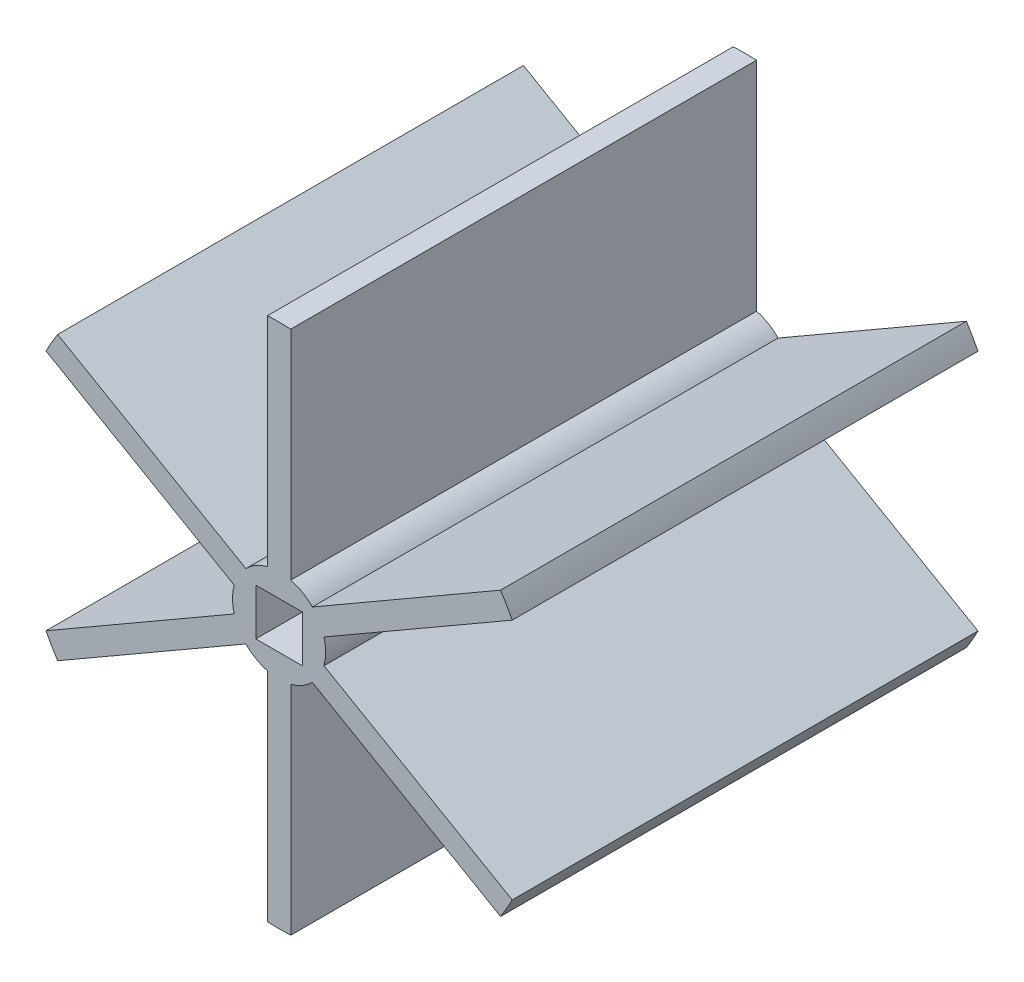
ISO-10303-21;
HEADER;
FILE_DESCRIPTION(('STEP AP214'),'2;1');
FILE_NAME('part.step','',(''),(''),'','','');
FILE_SCHEMA(('AUTOMOTIVE_DESIGN { 1 0 10303 214 1 1 1 1 }'));
ENDSEC;
DATA;
#1=APPLICATION_CONTEXT('core data for automotive mechanical design processes');
#2=APPLICATION_PROTOCOL_DEFINITION('international standard','automotive_design',2000,#1);
#3=PRODUCT_CONTEXT('',#1,'mechanical');
#4=PRODUCT('Part','Part','',(#3));
#5=PRODUCT_RELATED_PRODUCT_CATEGORY('part','',(#4));
#6=PRODUCT_DEFINITION_FORMATION('','',#4);
#7=PRODUCT_DEFINITION_CONTEXT('part definition',#1,'design');
#8=PRODUCT_DEFINITION('design','',#6,#7);
#9=PRODUCT_DEFINITION_SHAPE('','',#8);
#10=(LENGTH_UNIT() NAMED_UNIT(*) SI_UNIT(.MILLI.,.METRE.));
#11=(NAMED_UNIT(*) PLANE_ANGLE_UNIT() SI_UNIT($,.RADIAN.));
#12=(NAMED_UNIT(*) SI_UNIT($,.STERADIAN.) SOLID_ANGLE_UNIT());
#13=UNCERTAINTY_MEASURE_WITH_UNIT(LENGTH_MEASURE(1.E-05),#10,'distance_accuracy_value','');
#14=(GEOMETRIC_REPRESENTATION_CONTEXT(3) GLOBAL_UNCERTAINTY_ASSIGNED_CONTEXT((#13)) GLOBAL_UNIT_ASSIGNED_CONTEXT((#10,
#11,#12)) REPRESENTATION_CONTEXT('',''));
#15=CARTESIAN_POINT('',(0.,0.,0.));
#16=DIRECTION('',(0.,0.,1.));
#17=DIRECTION('',(1.,0.,0.));
#18=AXIS2_PLACEMENT_3D('',#15,#16,#17);
#19=CARTESIAN_POINT('',(0.624999999999983,1.08253175473052,25.));
#20=DIRECTION('',(-0.499999999999999,-0.866025403784439,0.));
#21=DIRECTION('',(0.866025403784439,-0.499999999999999,0.));
#22=AXIS2_PLACEMENT_3D('',#19,#20,#21);
#23=PLANE('',#22);
#24=DIRECTION('',(-0.866025403784439,0.499999999999999,0.));
#25=VECTOR('',#24,1.);
#26=CARTESIAN_POINT('',(0.624999999999983,1.08253175473052,-25.));
#27=LINE('',#26,#25);
#28=CARTESIAN_POINT('',(25.0229123082283,-13.00360948409,-25.));
#29=VERTEX_POINT('',#28);
#30=CARTESIAN_POINT('',(4.8176274578121,-1.33808283664911,-25.));
#31=VERTEX_POINT('',#30);
#32=EDGE_CURVE('E270',#29,#31,#27,.T.);
#33=ORIENTED_EDGE('',*,*,#32,.T.);
#34=DIRECTION('',(0.,0.,-1.));
#35=VECTOR('',#34,1.);
#36=CARTESIAN_POINT('',(4.8176274578121,-1.33808283664911,25.));
#37=LINE('',#36,#35);
#38=CARTESIAN_POINT('',(4.8176274578121,-1.33808283664911,25.));
#39=VERTEX_POINT('',#38);
#40=EDGE_CURVE('E11',#39,#31,#37,.T.);
#41=ORIENTED_EDGE('',*,*,#40,.F.);
#42=DIRECTION('',(-0.866025403784439,0.499999999999999,0.));
#43=VECTOR('',#42,1.);
#44=CARTESIAN_POINT('',(0.624999999999983,1.08253175473052,25.));
#45=LINE('',#44,#43);
#46=CARTESIAN_POINT('',(25.0229123082283,-13.00360948409,25.));
#47=VERTEX_POINT('',#46);
#48=EDGE_CURVE('E511',#47,#39,#45,.T.);
#49=ORIENTED_EDGE('',*,*,#48,.F.);
#50=DIRECTION('',(0.,0.,-1.));
#51=VECTOR('',#50,1.);
#52=CARTESIAN_POINT('',(25.0229123082283,-13.00360948409,25.));
#53=LINE('',#52,#51);
#54=EDGE_CURVE('E53',#47,#29,#53,.T.);
#55=ORIENTED_EDGE('',*,*,#54,.T.);
#56=EDGE_LOOP('',(#33,#41,#49,#55));
#57=FACE_BOUND('',#56,.T.);
#58=ADVANCED_FACE('F34',(#57),#23,.F.);
#59=CARTESIAN_POINT('',(0.,0.,25.));
#60=DIRECTION('',(0.,0.,-1.));
#61=DIRECTION('',(-1.,0.,0.));
#62=AXIS2_PLACEMENT_3D('',#59,#60,#61);
#63=CYLINDRICAL_SURFACE('',#62,5.);
#64=CARTESIAN_POINT('',(0.,0.,-25.));
#65=DIRECTION('',(0.,0.,1.));
#66=DIRECTION('',(1.,0.,0.));
#67=AXIS2_PLACEMENT_3D('',#64,#65,#66);
#68=CIRCLE('',#67,5.);
#69=CARTESIAN_POINT('',(4.81762745781211,1.33808283664908,-25.));
#70=VERTEX_POINT('',#69);
#71=EDGE_CURVE('E272',#31,#70,#68,.T.);
#72=ORIENTED_EDGE('',*,*,#71,.T.);
#73=DIRECTION('',(0.,0.,-1.));
#74=VECTOR('',#73,1.);
#75=CARTESIAN_POINT('',(4.81762745781211,1.33808283664908,25.));
#76=LINE('',#75,#74);
#77=CARTESIAN_POINT('',(4.81762745781211,1.33808283664908,25.));
#78=VERTEX_POINT('',#77);
#79=EDGE_CURVE('E44',#78,#70,#76,.T.);
#80=ORIENTED_EDGE('',*,*,#79,.F.);
#81=CARTESIAN_POINT('',(0.,0.,25.));
#82=DIRECTION('',(0.,0.,1.));
#83=DIRECTION('',(1.,0.,0.));
#84=AXIS2_PLACEMENT_3D('',#81,#82,#83);
#85=CIRCLE('',#84,5.);
#86=EDGE_CURVE('E513',#39,#78,#85,.T.);
#87=ORIENTED_EDGE('',*,*,#86,.F.);
#88=ORIENTED_EDGE('',*,*,#40,.T.);
#89=EDGE_LOOP('',(#72,#80,#87,#88));
#90=FACE_BOUND('',#89,.T.);
#91=ADVANCED_FACE('F409',(#90),#63,.T.);
#92=CARTESIAN_POINT('',(0.625000000000005,-1.08253175473056,25.));
#93=DIRECTION('',(0.5,-0.866025403784438,0.));
#94=DIRECTION('',(0.866025403784438,0.5,0.));
#95=AXIS2_PLACEMENT_3D('',#92,#93,#94);
#96=PLANE('',#95);
#97=DIRECTION('',(-0.866025403784438,-0.5,0.));
#98=VECTOR('',#97,1.);
#99=CARTESIAN_POINT('',(0.625000000000005,-1.08253175473056,-25.));
#100=LINE('',#99,#98);
#101=CARTESIAN_POINT('',(25.0229123082283,13.00360948409,-25.));
#102=VERTEX_POINT('',#101);
#103=EDGE_CURVE('E275',#102,#70,#100,.T.);
#104=ORIENTED_EDGE('',*,*,#103,.F.);
#105=DIRECTION('',(0.,0.,-1.));
#106=VECTOR('',#105,1.);
#107=CARTESIAN_POINT('',(25.0229123082283,13.00360948409,25.));
#108=LINE('',#107,#106);
#109=CARTESIAN_POINT('',(25.0229123082283,13.00360948409,25.));
#110=VERTEX_POINT('',#109);
#111=EDGE_CURVE('E375',#110,#102,#108,.T.);
#112=ORIENTED_EDGE('',*,*,#111,.F.);
#113=DIRECTION('',(-0.866025403784438,-0.5,0.));
#114=VECTOR('',#113,1.);
#115=CARTESIAN_POINT('',(0.625000000000005,-1.08253175473056,25.));
#116=LINE('',#115,#114);
#117=EDGE_CURVE('E515',#110,#78,#116,.T.);
#118=ORIENTED_EDGE('',*,*,#117,.T.);
#119=ORIENTED_EDGE('',*,*,#79,.T.);
#120=EDGE_LOOP('',(#104,#112,#118,#119));
#121=FACE_BOUND('',#120,.T.);
#122=ADVANCED_FACE('F414',(#121),#96,.T.);
#123=CARTESIAN_POINT('',(0.,0.,25.));
#124=DIRECTION('',(0.,0.,-1.));
#125=DIRECTION('',(-1.,0.,0.));
#126=AXIS2_PLACEMENT_3D('',#123,#124,#125);
#127=CYLINDRICAL_SURFACE('',#126,28.2);
#128=CARTESIAN_POINT('',(0.,0.,-25.));
#129=DIRECTION('',(0.,0.,1.));
#130=DIRECTION('',(1.,0.,0.));
#131=AXIS2_PLACEMENT_3D('',#128,#129,#130);
#132=CIRCLE('',#131,28.2);
#133=CARTESIAN_POINT('',(23.7729123082283,15.1686729935511,-25.));
#134=VERTEX_POINT('',#133);
#135=EDGE_CURVE('E278',#134,#102,#132,.F.);
#136=ORIENTED_EDGE('',*,*,#135,.F.);
#137=DIRECTION('',(0.,0.,-1.));
#138=VECTOR('',#137,1.);
#139=CARTESIAN_POINT('',(23.7729123082283,15.1686729935511,25.));
#140=LINE('',#139,#138);
#141=CARTESIAN_POINT('',(23.7729123082283,15.1686729935511,25.));
#142=VERTEX_POINT('',#141);
#143=EDGE_CURVE('E373',#142,#134,#140,.T.);
#144=ORIENTED_EDGE('',*,*,#143,.F.);
#145=CARTESIAN_POINT('',(0.,0.,25.));
#146=DIRECTION('',(0.,0.,1.));
#147=DIRECTION('',(1.,0.,0.));
#148=AXIS2_PLACEMENT_3D('',#145,#146,#147);
#149=CIRCLE('',#148,28.2);
#150=EDGE_CURVE('E518',#142,#110,#149,.F.);
#151=ORIENTED_EDGE('',*,*,#150,.T.);
#152=ORIENTED_EDGE('',*,*,#111,.T.);
#153=EDGE_LOOP('',(#136,#144,#151,#152));
#154=FACE_BOUND('',#153,.T.);
#155=ADVANCED_FACE('F420',(#154),#127,.T.);
#156=CARTESIAN_POINT('',(-0.624999999999993,1.08253175473054,25.));
#157=DIRECTION('',(0.500000000000001,-0.866025403784438,0.));
#158=DIRECTION('',(0.866025403784438,0.500000000000001,0.));
#159=AXIS2_PLACEMENT_3D('',#156,#157,#158);
#160=PLANE('',#159);
#161=DIRECTION('',(-0.866025403784438,-0.500000000000001,0.));
#162=VECTOR('',#161,1.);
#163=CARTESIAN_POINT('',(-0.624999999999993,1.08253175473054,-25.));
#164=LINE('',#163,#162);
#165=CARTESIAN_POINT('',(3.56762745781211,3.50314634611018,-25.));
#166=VERTEX_POINT('',#165);
#167=EDGE_CURVE('E281',#134,#166,#164,.T.);
#168=ORIENTED_EDGE('',*,*,#167,.T.);
#169=DIRECTION('',(0.,0.,-1.));
#170=VECTOR('',#169,1.);
#171=CARTESIAN_POINT('',(3.56762745781211,3.50314634611018,25.));
#172=LINE('',#171,#170);
#173=CARTESIAN_POINT('',(3.56762745781211,3.50314634611018,25.));
#174=VERTEX_POINT('',#173);
#175=EDGE_CURVE('E370',#174,#166,#172,.T.);
#176=ORIENTED_EDGE('',*,*,#175,.F.);
#177=DIRECTION('',(-0.866025403784438,-0.500000000000001,0.));
#178=VECTOR('',#177,1.);
#179=CARTESIAN_POINT('',(-0.624999999999993,1.08253175473054,25.));
#180=LINE('',#179,#178);
#181=EDGE_CURVE('E521',#142,#174,#180,.T.);
#182=ORIENTED_EDGE('',*,*,#181,.F.);
#183=ORIENTED_EDGE('',*,*,#143,.T.);
#184=EDGE_LOOP('',(#168,#176,#182,#183));
#185=FACE_BOUND('',#184,.T.);
#186=ADVANCED_FACE('F424',(#185),#160,.F.);
#187=CARTESIAN_POINT('',(0.,0.,25.));
#188=DIRECTION('',(0.,0.,-1.));
#189=DIRECTION('',(-1.,0.,0.));
#190=AXIS2_PLACEMENT_3D('',#187,#188,#189);
#191=CYLINDRICAL_SURFACE('',#190,5.);
#192=CARTESIAN_POINT('',(0.,0.,-25.));
#193=DIRECTION('',(0.,0.,1.));
#194=DIRECTION('',(1.,0.,0.));
#195=AXIS2_PLACEMENT_3D('',#192,#193,#194);
#196=CIRCLE('',#195,5.);
#197=CARTESIAN_POINT('',(1.25,4.84122918275927,-25.));
#198=VERTEX_POINT('',#197);
#199=EDGE_CURVE('E283',#166,#198,#196,.T.);
#200=ORIENTED_EDGE('',*,*,#199,.T.);
#201=DIRECTION('',(0.,0.,-1.));
#202=VECTOR('',#201,1.);
#203=CARTESIAN_POINT('',(1.25,4.84122918275927,25.));
#204=LINE('',#203,#202);
#205=CARTESIAN_POINT('',(1.25,4.84122918275927,25.));
#206=VERTEX_POINT('',#205);
#207=EDGE_CURVE('E368',#206,#198,#204,.T.);
#208=ORIENTED_EDGE('',*,*,#207,.F.);
#209=CARTESIAN_POINT('',(0.,0.,25.));
#210=DIRECTION('',(0.,0.,1.));
#211=DIRECTION('',(1.,0.,0.));
#212=AXIS2_PLACEMENT_3D('',#209,#210,#211);
#213=CIRCLE('',#212,5.);
#214=EDGE_CURVE('E523',#174,#206,#213,.T.);
#215=ORIENTED_EDGE('',*,*,#214,.F.);
#216=ORIENTED_EDGE('',*,*,#175,.T.);
#217=EDGE_LOOP('',(#200,#208,#215,#216));
#218=FACE_BOUND('',#217,.T.);
#219=ADVANCED_FACE('F428',(#218),#191,.T.);
#220=CARTESIAN_POINT('',(1.25,0.,25.));
#221=DIRECTION('',(1.,0.,0.));
#222=DIRECTION('',(0.,1.,0.));
#223=AXIS2_PLACEMENT_3D('',#220,#221,#222);
#224=PLANE('',#223);
#225=DIRECTION('',(0.,-1.,0.));
#226=VECTOR('',#225,1.);
#227=CARTESIAN_POINT('',(1.25,0.,-25.));
#228=LINE('',#227,#226);
#229=CARTESIAN_POINT('',(1.25,28.172282477641,-25.));
#230=VERTEX_POINT('',#229);
#231=EDGE_CURVE('E286',#230,#198,#228,.T.);
#232=ORIENTED_EDGE('',*,*,#231,.F.);
#233=DIRECTION('',(0.,0.,-1.));
#234=VECTOR('',#233,1.);
#235=CARTESIAN_POINT('',(1.25,28.172282477641,25.));
#236=LINE('',#235,#234);
#237=CARTESIAN_POINT('',(1.25,28.172282477641,25.));
#238=VERTEX_POINT('',#237);
#239=EDGE_CURVE('E366',#238,#230,#236,.T.);
#240=ORIENTED_EDGE('',*,*,#239,.F.);
#241=DIRECTION('',(0.,-1.,0.));
#242=VECTOR('',#241,1.);
#243=CARTESIAN_POINT('',(1.25,0.,25.));
#244=LINE('',#243,#242);
#245=EDGE_CURVE('E525',#238,#206,#244,.T.);
#246=ORIENTED_EDGE('',*,*,#245,.T.);
#247=ORIENTED_EDGE('',*,*,#207,.T.);
#248=EDGE_LOOP('',(#232,#240,#246,#247));
#249=FACE_BOUND('',#248,.T.);
#250=ADVANCED_FACE('F432',(#249),#224,.T.);
#251=CARTESIAN_POINT('',(0.,0.,25.));
#252=DIRECTION('',(0.,0.,-1.));
#253=DIRECTION('',(-1.,0.,0.));
#254=AXIS2_PLACEMENT_3D('',#251,#252,#253);
#255=CYLINDRICAL_SURFACE('',#254,28.2);
#256=CARTESIAN_POINT('',(0.,0.,-25.));
#257=DIRECTION('',(0.,0.,1.));
#258=DIRECTION('',(1.,0.,0.));
#259=AXIS2_PLACEMENT_3D('',#256,#257,#258);
#260=CIRCLE('',#259,28.2);
#261=CARTESIAN_POINT('',(-1.25,28.172282477641,-25.));
#262=VERTEX_POINT('',#261);
#263=EDGE_CURVE('E289',#262,#230,#260,.F.);
#264=ORIENTED_EDGE('',*,*,#263,.F.);
#265=DIRECTION('',(0.,0.,-1.));
#266=VECTOR('',#265,1.);
#267=CARTESIAN_POINT('',(-1.25,28.172282477641,25.));
#268=LINE('',#267,#266);
#269=CARTESIAN_POINT('',(-1.25,28.172282477641,25.));
#270=VERTEX_POINT('',#269);
#271=EDGE_CURVE('E364',#270,#262,#268,.T.);
#272=ORIENTED_EDGE('',*,*,#271,.F.);
#273=CARTESIAN_POINT('',(0.,0.,25.));
#274=DIRECTION('',(0.,0.,1.));
#275=DIRECTION('',(1.,0.,0.));
#276=AXIS2_PLACEMENT_3D('',#273,#274,#275);
#277=CIRCLE('',#276,28.2);
#278=EDGE_CURVE('E528',#270,#238,#277,.F.);
#279=ORIENTED_EDGE('',*,*,#278,.T.);
#280=ORIENTED_EDGE('',*,*,#239,.T.);
#281=EDGE_LOOP('',(#264,#272,#279,#280));
#282=FACE_BOUND('',#281,.T.);
#283=ADVANCED_FACE('F436',(#282),#255,.T.);
#284=CARTESIAN_POINT('',(-1.25,0.,25.));
#285=DIRECTION('',(1.,0.,0.));
#286=DIRECTION('',(0.,1.,0.));
#287=AXIS2_PLACEMENT_3D('',#284,#285,#286);
#288=PLANE('',#287);
#289=DIRECTION('',(0.,-1.,0.));
#290=VECTOR('',#289,1.);
#291=CARTESIAN_POINT('',(-1.25,0.,-25.));
#292=LINE('',#291,#290);
#293=CARTESIAN_POINT('',(-1.25,4.84122918275927,-25.));
#294=VERTEX_POINT('',#293);
#295=EDGE_CURVE('E292',#262,#294,#292,.T.);
#296=ORIENTED_EDGE('',*,*,#295,.T.);
#297=DIRECTION('',(0.,0.,-1.));
#298=VECTOR('',#297,1.);
#299=CARTESIAN_POINT('',(-1.25,4.84122918275927,25.));
#300=LINE('',#299,#298);
#301=CARTESIAN_POINT('',(-1.25,4.84122918275927,25.));
#302=VERTEX_POINT('',#301);
#303=EDGE_CURVE('E361',#302,#294,#300,.T.);
#304=ORIENTED_EDGE('',*,*,#303,.F.);
#305=DIRECTION('',(0.,-1.,0.));
#306=VECTOR('',#305,1.);
#307=CARTESIAN_POINT('',(-1.25,0.,25.));
#308=LINE('',#307,#306);
#309=EDGE_CURVE('E531',#270,#302,#308,.T.);
#310=ORIENTED_EDGE('',*,*,#309,.F.);
#311=ORIENTED_EDGE('',*,*,#271,.T.);
#312=EDGE_LOOP('',(#296,#304,#310,#311));
#313=FACE_BOUND('',#312,.T.);
#314=ADVANCED_FACE('F440',(#313),#288,.F.);
#315=CARTESIAN_POINT('',(0.,0.,25.));
#316=DIRECTION('',(0.,0.,-1.));
#317=DIRECTION('',(-1.,0.,0.));
#318=AXIS2_PLACEMENT_3D('',#315,#316,#317);
#319=CYLINDRICAL_SURFACE('',#318,5.);
#320=CARTESIAN_POINT('',(0.,0.,-25.));
#321=DIRECTION('',(0.,0.,1.));
#322=DIRECTION('',(1.,0.,0.));
#323=AXIS2_PLACEMENT_3D('',#320,#321,#322);
#324=CIRCLE('',#323,5.);
#325=CARTESIAN_POINT('',(-3.56762745781206,3.50314634611022,-25.));
#326=VERTEX_POINT('',#325);
#327=EDGE_CURVE('E294',#294,#326,#324,.T.);
#328=ORIENTED_EDGE('',*,*,#327,.T.);
#329=DIRECTION('',(0.,0.,-1.));
#330=VECTOR('',#329,1.);
#331=CARTESIAN_POINT('',(-3.56762745781206,3.50314634611022,25.));
#332=LINE('',#331,#330);
#333=CARTESIAN_POINT('',(-3.56762745781206,3.50314634611022,25.));
#334=VERTEX_POINT('',#333);
#335=EDGE_CURVE('E359',#334,#326,#332,.T.);
#336=ORIENTED_EDGE('',*,*,#335,.F.);
#337=CARTESIAN_POINT('',(0.,0.,25.));
#338=DIRECTION('',(0.,0.,1.));
#339=DIRECTION('',(1.,0.,0.));
#340=AXIS2_PLACEMENT_3D('',#337,#338,#339);
#341=CIRCLE('',#340,5.);
#342=EDGE_CURVE('E533',#302,#334,#341,.T.);
#343=ORIENTED_EDGE('',*,*,#342,.F.);
#344=ORIENTED_EDGE('',*,*,#303,.T.);
#345=EDGE_LOOP('',(#328,#336,#343,#344));
#346=FACE_BOUND('',#345,.T.);
#347=ADVANCED_FACE('F444',(#346),#319,.T.);
#348=CARTESIAN_POINT('',(0.625000000000032,1.08253175473061,25.));
#349=DIRECTION('',(0.499999999999997,0.86602540378444,0.));
#350=DIRECTION('',(-0.86602540378444,0.499999999999997,0.));
#351=AXIS2_PLACEMENT_3D('',#348,#349,#350);
#352=PLANE('',#351);
#353=DIRECTION('',(0.86602540378444,-0.499999999999997,0.));
#354=VECTOR('',#353,1.);
#355=CARTESIAN_POINT('',(0.625000000000032,1.08253175473061,-25.));
#356=LINE('',#355,#354);
#357=CARTESIAN_POINT('',(-23.7729123082284,15.168672993551,-25.));
#358=VERTEX_POINT('',#357);
#359=EDGE_CURVE('E297',#358,#326,#356,.T.);
#360=ORIENTED_EDGE('',*,*,#359,.F.);
#361=DIRECTION('',(0.,0.,-1.));
#362=VECTOR('',#361,1.);
#363=CARTESIAN_POINT('',(-23.7729123082284,15.168672993551,25.));
#364=LINE('',#363,#362);
#365=CARTESIAN_POINT('',(-23.7729123082284,15.168672993551,25.));
#366=VERTEX_POINT('',#365);
#367=EDGE_CURVE('E357',#366,#358,#364,.T.);
#368=ORIENTED_EDGE('',*,*,#367,.F.);
#369=DIRECTION('',(0.86602540378444,-0.499999999999997,0.));
#370=VECTOR('',#369,1.);
#371=CARTESIAN_POINT('',(0.625000000000032,1.08253175473061,25.));
#372=LINE('',#371,#370);
#373=EDGE_CURVE('E535',#366,#334,#372,.T.);
#374=ORIENTED_EDGE('',*,*,#373,.T.);
#375=ORIENTED_EDGE('',*,*,#335,.T.);
#376=EDGE_LOOP('',(#360,#368,#374,#375));
#377=FACE_BOUND('',#376,.T.);
#378=ADVANCED_FACE('F448',(#377),#352,.T.);
#379=CARTESIAN_POINT('',(0.,0.,25.));
#380=DIRECTION('',(0.,0.,-1.));
#381=DIRECTION('',(-1.,0.,0.));
#382=AXIS2_PLACEMENT_3D('',#379,#380,#381);
#383=CYLINDRICAL_SURFACE('',#382,28.2);
#384=CARTESIAN_POINT('',(0.,0.,-25.));
#385=DIRECTION('',(0.,0.,1.));
#386=DIRECTION('',(1.,0.,0.));
#387=AXIS2_PLACEMENT_3D('',#384,#385,#386);
#388=CIRCLE('',#387,28.2);
#389=CARTESIAN_POINT('',(-25.0229123082284,13.0036094840899,-25.));
#390=VERTEX_POINT('',#389);
#391=EDGE_CURVE('E300',#390,#358,#388,.F.);
#392=ORIENTED_EDGE('',*,*,#391,.F.);
#393=DIRECTION('',(0.,0.,-1.));
#394=VECTOR('',#393,1.);
#395=CARTESIAN_POINT('',(-25.0229123082284,13.0036094840899,25.));
#396=LINE('',#395,#394);
#397=CARTESIAN_POINT('',(-25.0229123082284,13.0036094840899,25.));
#398=VERTEX_POINT('',#397);
#399=EDGE_CURVE('E355',#398,#390,#396,.T.);
#400=ORIENTED_EDGE('',*,*,#399,.F.);
#401=CARTESIAN_POINT('',(0.,0.,25.));
#402=DIRECTION('',(0.,0.,1.));
#403=DIRECTION('',(1.,0.,0.));
#404=AXIS2_PLACEMENT_3D('',#401,#402,#403);
#405=CIRCLE('',#404,28.2);
#406=EDGE_CURVE('E538',#398,#366,#405,.F.);
#407=ORIENTED_EDGE('',*,*,#406,.T.);
#408=ORIENTED_EDGE('',*,*,#367,.T.);
#409=EDGE_LOOP('',(#392,#400,#407,#408));
#410=FACE_BOUND('',#409,.T.);
#411=ADVANCED_FACE('F452',(#410),#383,.T.);
#412=CARTESIAN_POINT('',(-0.624999999999956,-1.08253175473048,25.));
#413=DIRECTION('',(0.499999999999997,0.86602540378444,0.));
#414=DIRECTION('',(-0.866025403784441,0.499999999999997,0.));
#415=AXIS2_PLACEMENT_3D('',#412,#413,#414);
#416=PLANE('',#415);
#417=DIRECTION('',(0.866025403784441,-0.499999999999997,0.));
#418=VECTOR('',#417,1.);
#419=CARTESIAN_POINT('',(-0.624999999999956,-1.08253175473048,-25.));
#420=LINE('',#419,#418);
#421=CARTESIAN_POINT('',(-4.81762745781209,1.33808283664915,-25.));
#422=VERTEX_POINT('',#421);
#423=EDGE_CURVE('E303',#390,#422,#420,.T.);
#424=ORIENTED_EDGE('',*,*,#423,.T.);
#425=DIRECTION('',(0.,0.,-1.));
#426=VECTOR('',#425,1.);
#427=CARTESIAN_POINT('',(-4.81762745781209,1.33808283664915,25.));
#428=LINE('',#427,#426);
#429=CARTESIAN_POINT('',(-4.81762745781209,1.33808283664915,25.));
#430=VERTEX_POINT('',#429);
#431=EDGE_CURVE('E352',#430,#422,#428,.T.);
#432=ORIENTED_EDGE('',*,*,#431,.F.);
#433=DIRECTION('',(0.866025403784441,-0.499999999999997,0.));
#434=VECTOR('',#433,1.);
#435=CARTESIAN_POINT('',(-0.624999999999956,-1.08253175473048,25.));
#436=LINE('',#435,#434);
#437=EDGE_CURVE('E541',#398,#430,#436,.T.);
#438=ORIENTED_EDGE('',*,*,#437,.F.);
#439=ORIENTED_EDGE('',*,*,#399,.T.);
#440=EDGE_LOOP('',(#424,#432,#438,#439));
#441=FACE_BOUND('',#440,.T.);
#442=ADVANCED_FACE('F456',(#441),#416,.F.);
#443=CARTESIAN_POINT('',(0.,0.,25.));
#444=DIRECTION('',(0.,0.,-1.));
#445=DIRECTION('',(-1.,0.,0.));
#446=AXIS2_PLACEMENT_3D('',#443,#444,#445);
#447=CYLINDRICAL_SURFACE('',#446,5.);
#448=CARTESIAN_POINT('',(0.,0.,-25.));
#449=DIRECTION('',(0.,0.,1.));
#450=DIRECTION('',(1.,0.,0.));
#451=AXIS2_PLACEMENT_3D('',#448,#449,#450);
#452=CIRCLE('',#451,5.);
#453=CARTESIAN_POINT('',(-4.81762745781211,-1.33808283664904,-25.));
#454=VERTEX_POINT('',#453);
#455=EDGE_CURVE('E305',#422,#454,#452,.T.);
#456=ORIENTED_EDGE('',*,*,#455,.T.);
#457=DIRECTION('',(0.,0.,-1.));
#458=VECTOR('',#457,1.);
#459=CARTESIAN_POINT('',(-4.81762745781211,-1.33808283664904,25.));
#460=LINE('',#459,#458);
#461=CARTESIAN_POINT('',(-4.81762745781211,-1.33808283664904,25.));
#462=VERTEX_POINT('',#461);
#463=EDGE_CURVE('E350',#462,#454,#460,.T.);
#464=ORIENTED_EDGE('',*,*,#463,.F.);
#465=CARTESIAN_POINT('',(0.,0.,25.));
#466=DIRECTION('',(0.,0.,1.));
#467=DIRECTION('',(1.,0.,0.));
#468=AXIS2_PLACEMENT_3D('',#465,#466,#467);
#469=CIRCLE('',#468,5.);
#470=EDGE_CURVE('E543',#430,#462,#469,.T.);
#471=ORIENTED_EDGE('',*,*,#470,.F.);
#472=ORIENTED_EDGE('',*,*,#431,.T.);
#473=EDGE_LOOP('',(#456,#464,#471,#472));
#474=FACE_BOUND('',#473,.T.);
#475=ADVANCED_FACE('F460',(#474),#447,.T.);
#476=CARTESIAN_POINT('',(-0.625000000000029,1.08253175473059,25.));
#477=DIRECTION('',(-0.500000000000002,0.866025403784437,0.));
#478=DIRECTION('',(-0.866025403784438,-0.500000000000002,0.));
#479=AXIS2_PLACEMENT_3D('',#476,#477,#478);
#480=PLANE('',#479);
#481=DIRECTION('',(0.866025403784438,0.500000000000002,0.));
#482=VECTOR('',#481,1.);
#483=CARTESIAN_POINT('',(-0.625000000000029,1.08253175473059,-25.));
#484=LINE('',#483,#482);
#485=CARTESIAN_POINT('',(-25.0229123082283,-13.00360948409,-25.));
#486=VERTEX_POINT('',#485);
#487=EDGE_CURVE('E308',#486,#454,#484,.T.);
#488=ORIENTED_EDGE('',*,*,#487,.F.);
#489=DIRECTION('',(0.,0.,-1.));
#490=VECTOR('',#489,1.);
#491=CARTESIAN_POINT('',(-25.0229123082283,-13.00360948409,25.));
#492=LINE('',#491,#490);
#493=CARTESIAN_POINT('',(-25.0229123082283,-13.00360948409,25.));
#494=VERTEX_POINT('',#493);
#495=EDGE_CURVE('E348',#494,#486,#492,.T.);
#496=ORIENTED_EDGE('',*,*,#495,.F.);
#497=DIRECTION('',(0.866025403784438,0.500000000000002,0.));
#498=VECTOR('',#497,1.);
#499=CARTESIAN_POINT('',(-0.625000000000029,1.08253175473059,25.));
#500=LINE('',#499,#498);
#501=EDGE_CURVE('E545',#494,#462,#500,.T.);
#502=ORIENTED_EDGE('',*,*,#501,.T.);
#503=ORIENTED_EDGE('',*,*,#463,.T.);
#504=EDGE_LOOP('',(#488,#496,#502,#503));
#505=FACE_BOUND('',#504,.T.);
#506=ADVANCED_FACE('F464',(#505),#480,.T.);
#507=CARTESIAN_POINT('',(0.,0.,25.));
#508=DIRECTION('',(0.,0.,-1.));
#509=DIRECTION('',(-1.,0.,0.));
#510=AXIS2_PLACEMENT_3D('',#507,#508,#509);
#511=CYLINDRICAL_SURFACE('',#510,28.2);
#512=CARTESIAN_POINT('',(0.,0.,-25.));
#513=DIRECTION('',(0.,0.,1.));
#514=DIRECTION('',(1.,0.,0.));
#515=AXIS2_PLACEMENT_3D('',#512,#513,#514);
#516=CIRCLE('',#515,28.2);
#517=CARTESIAN_POINT('',(-23.7729123082283,-15.1686729935511,-25.));
#518=VERTEX_POINT('',#517);
#519=EDGE_CURVE('E311',#518,#486,#516,.F.);
#520=ORIENTED_EDGE('',*,*,#519,.F.);
#521=DIRECTION('',(0.,0.,-1.));
#522=VECTOR('',#521,1.);
#523=CARTESIAN_POINT('',(-23.7729123082283,-15.1686729935511,25.));
#524=LINE('',#523,#522);
#525=CARTESIAN_POINT('',(-23.7729123082283,-15.1686729935511,25.));
#526=VERTEX_POINT('',#525);
#527=EDGE_CURVE('E346',#526,#518,#524,.T.);
#528=ORIENTED_EDGE('',*,*,#527,.F.);
#529=CARTESIAN_POINT('',(0.,0.,25.));
#530=DIRECTION('',(0.,0.,1.));
#531=DIRECTION('',(1.,0.,0.));
#532=AXIS2_PLACEMENT_3D('',#529,#530,#531);
#533=CIRCLE('',#532,28.2);
#534=EDGE_CURVE('E548',#526,#494,#533,.F.);
#535=ORIENTED_EDGE('',*,*,#534,.T.);
#536=ORIENTED_EDGE('',*,*,#495,.T.);
#537=EDGE_LOOP('',(#520,#528,#535,#536));
#538=FACE_BOUND('',#537,.T.);
#539=ADVANCED_FACE('F468',(#538),#511,.T.);
#540=CARTESIAN_POINT('',(0.624999999999973,-1.0825317547305,25.));
#541=DIRECTION('',(-0.500000000000002,0.866025403784437,0.));
#542=DIRECTION('',(-0.866025403784437,-0.500000000000002,0.));
#543=AXIS2_PLACEMENT_3D('',#540,#541,#542);
#544=PLANE('',#543);
#545=DIRECTION('',(0.866025403784437,0.500000000000002,0.));
#546=VECTOR('',#545,1.);
#547=CARTESIAN_POINT('',(0.624999999999973,-1.0825317547305,-25.));
#548=LINE('',#547,#546);
#549=CARTESIAN_POINT('',(-3.56762745781214,-3.50314634611015,-25.));
#550=VERTEX_POINT('',#549);
#551=EDGE_CURVE('E314',#518,#550,#548,.T.);
#552=ORIENTED_EDGE('',*,*,#551,.T.);
#553=DIRECTION('',(0.,0.,-1.));
#554=VECTOR('',#553,1.);
#555=CARTESIAN_POINT('',(-3.56762745781214,-3.50314634611015,25.));
#556=LINE('',#555,#554);
#557=CARTESIAN_POINT('',(-3.56762745781214,-3.50314634611015,25.));
#558=VERTEX_POINT('',#557);
#559=EDGE_CURVE('E343',#558,#550,#556,.T.);
#560=ORIENTED_EDGE('',*,*,#559,.F.);
#561=DIRECTION('',(0.866025403784437,0.500000000000002,0.));
#562=VECTOR('',#561,1.);
#563=CARTESIAN_POINT('',(0.624999999999973,-1.0825317547305,25.));
#564=LINE('',#563,#562);
#565=EDGE_CURVE('E551',#526,#558,#564,.T.);
#566=ORIENTED_EDGE('',*,*,#565,.F.);
#567=ORIENTED_EDGE('',*,*,#527,.T.);
#568=EDGE_LOOP('',(#552,#560,#566,#567));
#569=FACE_BOUND('',#568,.T.);
#570=ADVANCED_FACE('F472',(#569),#544,.F.);
#571=CARTESIAN_POINT('',(0.,0.,25.));
#572=DIRECTION('',(0.,0.,-1.));
#573=DIRECTION('',(-1.,0.,0.));
#574=AXIS2_PLACEMENT_3D('',#571,#572,#573);
#575=CYLINDRICAL_SURFACE('',#574,5.);
#576=CARTESIAN_POINT('',(0.,0.,-25.));
#577=DIRECTION('',(0.,0.,1.));
#578=DIRECTION('',(1.,0.,0.));
#579=AXIS2_PLACEMENT_3D('',#576,#577,#578);
#580=CIRCLE('',#579,5.);
#581=CARTESIAN_POINT('',(-1.25000000000003,-4.84122918275926,-25.));
#582=VERTEX_POINT('',#581);
#583=EDGE_CURVE('E316',#550,#582,#580,.T.);
#584=ORIENTED_EDGE('',*,*,#583,.T.);
#585=DIRECTION('',(0.,0.,-1.));
#586=VECTOR('',#585,1.);
#587=CARTESIAN_POINT('',(-1.25000000000003,-4.84122918275926,25.));
#588=LINE('',#587,#586);
#589=CARTESIAN_POINT('',(-1.25000000000003,-4.84122918275926,25.));
#590=VERTEX_POINT('',#589);
#591=EDGE_CURVE('E341',#590,#582,#588,.T.);
#592=ORIENTED_EDGE('',*,*,#591,.F.);
#593=CARTESIAN_POINT('',(0.,0.,25.));
#594=DIRECTION('',(0.,0.,1.));
#595=DIRECTION('',(1.,0.,0.));
#596=AXIS2_PLACEMENT_3D('',#593,#594,#595);
#597=CIRCLE('',#596,5.);
#598=EDGE_CURVE('E553',#558,#590,#597,.T.);
#599=ORIENTED_EDGE('',*,*,#598,.F.);
#600=ORIENTED_EDGE('',*,*,#559,.T.);
#601=EDGE_LOOP('',(#584,#592,#599,#600));
#602=FACE_BOUND('',#601,.T.);
#603=ADVANCED_FACE('F476',(#602),#575,.T.);
#604=CARTESIAN_POINT('',(-1.25000000000004,0.,25.));
#605=DIRECTION('',(-1.,0.,0.));
#606=DIRECTION('',(0.,-1.,0.));
#607=AXIS2_PLACEMENT_3D('',#604,#605,#606);
#608=PLANE('',#607);
#609=DIRECTION('',(0.,1.,0.));
#610=VECTOR('',#609,1.);
#611=CARTESIAN_POINT('',(-1.25000000000004,0.,-25.));
#612=LINE('',#611,#610);
#613=CARTESIAN_POINT('',(-1.25,-28.172282477641,-25.));
#614=VERTEX_POINT('',#613);
#615=EDGE_CURVE('E319',#614,#582,#612,.T.);
#616=ORIENTED_EDGE('',*,*,#615,.F.);
#617=DIRECTION('',(0.,0.,-1.));
#618=VECTOR('',#617,1.);
#619=CARTESIAN_POINT('',(-1.25,-28.172282477641,25.));
#620=LINE('',#619,#618);
#621=CARTESIAN_POINT('',(-1.25,-28.172282477641,25.));
#622=VERTEX_POINT('',#621);
#623=EDGE_CURVE('E339',#622,#614,#620,.T.);
#624=ORIENTED_EDGE('',*,*,#623,.F.);
#625=DIRECTION('',(0.,1.,0.));
#626=VECTOR('',#625,1.);
#627=CARTESIAN_POINT('',(-1.25000000000004,0.,25.));
#628=LINE('',#627,#626);
#629=EDGE_CURVE('E555',#622,#590,#628,.T.);
#630=ORIENTED_EDGE('',*,*,#629,.T.);
#631=ORIENTED_EDGE('',*,*,#591,.T.);
#632=EDGE_LOOP('',(#616,#624,#630,#631));
#633=FACE_BOUND('',#632,.T.);
#634=ADVANCED_FACE('F480',(#633),#608,.T.);
#635=CARTESIAN_POINT('',(0.,0.,25.));
#636=DIRECTION('',(0.,0.,-1.));
#637=DIRECTION('',(-1.,0.,0.));
#638=AXIS2_PLACEMENT_3D('',#635,#636,#637);
#639=CYLINDRICAL_SURFACE('',#638,28.2);
#640=CARTESIAN_POINT('',(0.,0.,-25.));
#641=DIRECTION('',(0.,0.,1.));
#642=DIRECTION('',(1.,0.,0.));
#643=AXIS2_PLACEMENT_3D('',#640,#641,#642);
#644=CIRCLE('',#643,28.2);
#645=CARTESIAN_POINT('',(1.25,-28.172282477641,-25.));
#646=VERTEX_POINT('',#645);
#647=EDGE_CURVE('E322',#646,#614,#644,.F.);
#648=ORIENTED_EDGE('',*,*,#647,.F.);
#649=DIRECTION('',(0.,0.,-1.));
#650=VECTOR('',#649,1.);
#651=CARTESIAN_POINT('',(1.25,-28.172282477641,25.));
#652=LINE('',#651,#650);
#653=CARTESIAN_POINT('',(1.25,-28.172282477641,25.));
#654=VERTEX_POINT('',#653);
#655=EDGE_CURVE('E337',#654,#646,#652,.T.);
#656=ORIENTED_EDGE('',*,*,#655,.F.);
#657=CARTESIAN_POINT('',(0.,0.,25.));
#658=DIRECTION('',(0.,0.,1.));
#659=DIRECTION('',(1.,0.,0.));
#660=AXIS2_PLACEMENT_3D('',#657,#658,#659);
#661=CIRCLE('',#660,28.2);
#662=EDGE_CURVE('E558',#654,#622,#661,.F.);
#663=ORIENTED_EDGE('',*,*,#662,.T.);
#664=ORIENTED_EDGE('',*,*,#623,.T.);
#665=EDGE_LOOP('',(#648,#656,#663,#664));
#666=FACE_BOUND('',#665,.T.);
#667=ADVANCED_FACE('F484',(#666),#639,.T.);
#668=CARTESIAN_POINT('',(1.24999999999996,0.,25.));
#669=DIRECTION('',(-1.,0.,0.));
#670=DIRECTION('',(0.,-1.,0.));
#671=AXIS2_PLACEMENT_3D('',#668,#669,#670);
#672=PLANE('',#671);
#673=DIRECTION('',(0.,1.,0.));
#674=VECTOR('',#673,1.);
#675=CARTESIAN_POINT('',(1.24999999999996,0.,-25.));
#676=LINE('',#675,#674);
#677=CARTESIAN_POINT('',(1.24999999999996,-4.84122918275928,-25.));
#678=VERTEX_POINT('',#677);
#679=EDGE_CURVE('E325',#646,#678,#676,.T.);
#680=ORIENTED_EDGE('',*,*,#679,.T.);
#681=DIRECTION('',(0.,0.,-1.));
#682=VECTOR('',#681,1.);
#683=CARTESIAN_POINT('',(1.24999999999996,-4.84122918275928,25.));
#684=LINE('',#683,#682);
#685=CARTESIAN_POINT('',(1.24999999999996,-4.84122918275928,25.));
#686=VERTEX_POINT('',#685);
#687=EDGE_CURVE('E249',#686,#678,#684,.T.);
#688=ORIENTED_EDGE('',*,*,#687,.F.);
#689=DIRECTION('',(0.,1.,0.));
#690=VECTOR('',#689,1.);
#691=CARTESIAN_POINT('',(1.24999999999996,0.,25.));
#692=LINE('',#691,#690);
#693=EDGE_CURVE('E237',#654,#686,#692,.T.);
#694=ORIENTED_EDGE('',*,*,#693,.F.);
#695=ORIENTED_EDGE('',*,*,#655,.T.);
#696=EDGE_LOOP('',(#680,#688,#694,#695));
#697=FACE_BOUND('',#696,.T.);
#698=ADVANCED_FACE('F488',(#697),#672,.F.);
#699=CARTESIAN_POINT('',(0.,0.,25.));
#700=DIRECTION('',(0.,0.,-1.));
#701=DIRECTION('',(-1.,0.,0.));
#702=AXIS2_PLACEMENT_3D('',#699,#700,#701);
#703=CYLINDRICAL_SURFACE('',#702,5.);
#704=CARTESIAN_POINT('',(0.,0.,-25.));
#705=DIRECTION('',(0.,0.,1.));
#706=DIRECTION('',(1.,0.,0.));
#707=AXIS2_PLACEMENT_3D('',#704,#705,#706);
#708=CIRCLE('',#707,5.);
#709=CARTESIAN_POINT('',(3.56762745781209,-3.5031463461102,-25.));
#710=VERTEX_POINT('',#709);
#711=EDGE_CURVE('E246',#678,#710,#708,.T.);
#712=ORIENTED_EDGE('',*,*,#711,.T.);
#713=DIRECTION('',(0.,0.,-1.));
#714=VECTOR('',#713,1.);
#715=CARTESIAN_POINT('',(3.56762745781209,-3.5031463461102,25.));
#716=LINE('',#715,#714);
#717=CARTESIAN_POINT('',(3.56762745781209,-3.5031463461102,25.));
#718=VERTEX_POINT('',#717);
#719=EDGE_CURVE('E243',#718,#710,#716,.T.);
#720=ORIENTED_EDGE('',*,*,#719,.F.);
#721=CARTESIAN_POINT('',(0.,0.,25.));
#722=DIRECTION('',(0.,0.,1.));
#723=DIRECTION('',(1.,0.,0.));
#724=AXIS2_PLACEMENT_3D('',#721,#722,#723);
#725=CIRCLE('',#724,5.);
#726=EDGE_CURVE('E228',#686,#718,#725,.T.);
#727=ORIENTED_EDGE('',*,*,#726,.F.);
#728=ORIENTED_EDGE('',*,*,#687,.T.);
#729=EDGE_LOOP('',(#712,#720,#727,#728));
#730=FACE_BOUND('',#729,.T.);
#731=ADVANCED_FACE('F244',(#730),#703,.T.);
#732=CARTESIAN_POINT('',(-0.625000000000011,-1.08253175473057,25.));
#733=DIRECTION('',(-0.499999999999999,-0.866025403784439,0.));
#734=DIRECTION('',(0.866025403784439,-0.499999999999999,0.));
#735=AXIS2_PLACEMENT_3D('',#732,#733,#734);
#736=PLANE('',#735);
#737=DIRECTION('',(-0.866025403784439,0.499999999999999,0.));
#738=VECTOR('',#737,1.);
#739=CARTESIAN_POINT('',(-0.625000000000011,-1.08253175473057,-25.));
#740=LINE('',#739,#738);
#741=CARTESIAN_POINT('',(23.7729123082284,-15.1686729935511,-25.));
#742=VERTEX_POINT('',#741);
#743=EDGE_CURVE('E328',#742,#710,#740,.T.);
#744=ORIENTED_EDGE('',*,*,#743,.F.);
#745=DIRECTION('',(0.,0.,-1.));
#746=VECTOR('',#745,1.);
#747=CARTESIAN_POINT('',(23.7729123082284,-15.1686729935511,25.));
#748=LINE('',#747,#746);
#749=CARTESIAN_POINT('',(23.7729123082284,-15.1686729935511,25.));
#750=VERTEX_POINT('',#749);
#751=EDGE_CURVE('E139',#750,#742,#748,.T.);
#752=ORIENTED_EDGE('',*,*,#751,.F.);
#753=DIRECTION('',(-0.866025403784439,0.499999999999999,0.));
#754=VECTOR('',#753,1.);
#755=CARTESIAN_POINT('',(-0.625000000000011,-1.08253175473057,25.));
#756=LINE('',#755,#754);
#757=EDGE_CURVE('E234',#750,#718,#756,.T.);
#758=ORIENTED_EDGE('',*,*,#757,.T.);
#759=ORIENTED_EDGE('',*,*,#719,.T.);
#760=EDGE_LOOP('',(#744,#752,#758,#759));
#761=FACE_BOUND('',#760,.T.);
#762=ADVANCED_FACE('F251',(#761),#736,.T.);
#763=CARTESIAN_POINT('',(0.,-2.5,25.));
#764=DIRECTION('',(0.,-1.,0.));
#765=DIRECTION('',(1.,0.,0.));
#766=AXIS2_PLACEMENT_3D('',#763,#764,#765);
#767=PLANE('',#766);
#768=DIRECTION('',(-1.,0.,0.));
#769=VECTOR('',#768,1.);
#770=CARTESIAN_POINT('',(0.,-2.5,-25.));
#771=LINE('',#770,#769);
#772=CARTESIAN_POINT('',(2.5,-2.5,-25.));
#773=VERTEX_POINT('',#772);
#774=CARTESIAN_POINT('',(-2.5,-2.5,-25.));
#775=VERTEX_POINT('',#774);
#776=EDGE_CURVE('E258',#773,#775,#771,.T.);
#777=ORIENTED_EDGE('',*,*,#776,.T.);
#778=DIRECTION('',(0.,0.,-1.));
#779=VECTOR('',#778,1.);
#780=CARTESIAN_POINT('',(-2.5,-2.5,25.));
#781=LINE('',#780,#779);
#782=CARTESIAN_POINT('',(-2.5,-2.5,25.));
#783=VERTEX_POINT('',#782);
#784=EDGE_CURVE('E38',#783,#775,#781,.T.);
#785=ORIENTED_EDGE('',*,*,#784,.F.);
#786=DIRECTION('',(-1.,0.,0.));
#787=VECTOR('',#786,1.);
#788=CARTESIAN_POINT('',(0.,-2.5,25.));
#789=LINE('',#788,#787);
#790=CARTESIAN_POINT('',(2.5,-2.5,25.));
#791=VERTEX_POINT('',#790);
#792=EDGE_CURVE('E333',#791,#783,#789,.T.);
#793=ORIENTED_EDGE('',*,*,#792,.F.);
#794=DIRECTION('',(0.,0.,-1.));
#795=VECTOR('',#794,1.);
#796=CARTESIAN_POINT('',(2.5,-2.5,25.));
#797=LINE('',#796,#795);
#798=EDGE_CURVE('E254',#791,#773,#797,.T.);
#799=ORIENTED_EDGE('',*,*,#798,.T.);
#800=EDGE_LOOP('',(#777,#785,#793,#799));
#801=FACE_BOUND('',#800,.T.);
#802=ADVANCED_FACE('F36',(#801),#767,.F.);
#803=CARTESIAN_POINT('',(-2.5,0.,25.));
#804=DIRECTION('',(-1.,0.,0.));
#805=DIRECTION('',(0.,0.,1.));
#806=AXIS2_PLACEMENT_3D('',#803,#804,#805);
#807=PLANE('',#806);
#808=DIRECTION('',(0.,1.,0.));
#809=VECTOR('',#808,1.);
#810=CARTESIAN_POINT('',(-2.5,0.,-25.));
#811=LINE('',#810,#809);
#812=CARTESIAN_POINT('',(-2.5,2.5,-25.));
#813=VERTEX_POINT('',#812);
#814=EDGE_CURVE('E261',#775,#813,#811,.T.);
#815=ORIENTED_EDGE('',*,*,#814,.T.);
#816=DIRECTION('',(0.,0.,-1.));
#817=VECTOR('',#816,1.);
#818=CARTESIAN_POINT('',(-2.5,2.5,25.));
#819=LINE('',#818,#817);
#820=CARTESIAN_POINT('',(-2.5,2.5,25.));
#821=VERTEX_POINT('',#820);
#822=EDGE_CURVE('E380',#821,#813,#819,.T.);
#823=ORIENTED_EDGE('',*,*,#822,.F.);
#824=DIRECTION('',(0.,1.,0.));
#825=VECTOR('',#824,1.);
#826=CARTESIAN_POINT('',(-2.5,0.,25.));
#827=LINE('',#826,#825);
#828=EDGE_CURVE('E152',#783,#821,#827,.T.);
#829=ORIENTED_EDGE('',*,*,#828,.F.);
#830=ORIENTED_EDGE('',*,*,#784,.T.);
#831=EDGE_LOOP('',(#815,#823,#829,#830));
#832=FACE_BOUND('',#831,.T.);
#833=ADVANCED_FACE('F385',(#832),#807,.F.);
#834=CARTESIAN_POINT('',(0.,2.5,25.));
#835=DIRECTION('',(0.,-1.,0.));
#836=DIRECTION('',(1.,0.,0.));
#837=AXIS2_PLACEMENT_3D('',#834,#835,#836);
#838=PLANE('',#837);
#839=DIRECTION('',(-1.,0.,0.));
#840=VECTOR('',#839,1.);
#841=CARTESIAN_POINT('',(0.,2.5,-25.));
#842=LINE('',#841,#840);
#843=CARTESIAN_POINT('',(2.5,2.5,-25.));
#844=VERTEX_POINT('',#843);
#845=EDGE_CURVE('E264',#844,#813,#842,.T.);
#846=ORIENTED_EDGE('',*,*,#845,.F.);
#847=DIRECTION('',(0.,0.,-1.));
#848=VECTOR('',#847,1.);
#849=CARTESIAN_POINT('',(2.5,2.5,25.));
#850=LINE('',#849,#848);
#851=CARTESIAN_POINT('',(2.5,2.5,25.));
#852=VERTEX_POINT('',#851);
#853=EDGE_CURVE('E379',#852,#844,#850,.T.);
#854=ORIENTED_EDGE('',*,*,#853,.F.);
#855=DIRECTION('',(-1.,0.,0.));
#856=VECTOR('',#855,1.);
#857=CARTESIAN_POINT('',(0.,2.5,25.));
#858=LINE('',#857,#856);
#859=EDGE_CURVE('E506',#852,#821,#858,.T.);
#860=ORIENTED_EDGE('',*,*,#859,.T.);
#861=ORIENTED_EDGE('',*,*,#822,.T.);
#862=EDGE_LOOP('',(#846,#854,#860,#861));
#863=FACE_BOUND('',#862,.T.);
#864=ADVANCED_FACE('F399',(#863),#838,.T.);
#865=CARTESIAN_POINT('',(2.5,0.,25.));
#866=DIRECTION('',(-1.,0.,0.));
#867=DIRECTION('',(0.,0.,1.));
#868=AXIS2_PLACEMENT_3D('',#865,#866,#867);
#869=PLANE('',#868);
#870=DIRECTION('',(0.,1.,0.));
#871=VECTOR('',#870,1.);
#872=CARTESIAN_POINT('',(2.5,0.,-25.));
#873=LINE('',#872,#871);
#874=EDGE_CURVE('E267',#773,#844,#873,.T.);
#875=ORIENTED_EDGE('',*,*,#874,.F.);
#876=ORIENTED_EDGE('',*,*,#798,.F.);
#877=DIRECTION('',(0.,1.,0.));
#878=VECTOR('',#877,1.);
#879=CARTESIAN_POINT('',(2.5,0.,25.));
#880=LINE('',#879,#878);
#881=EDGE_CURVE('E397',#791,#852,#880,.T.);
#882=ORIENTED_EDGE('',*,*,#881,.T.);
#883=ORIENTED_EDGE('',*,*,#853,.T.);
#884=EDGE_LOOP('',(#875,#876,#882,#883));
#885=FACE_BOUND('',#884,.T.);
#886=ADVANCED_FACE('F394',(#885),#869,.T.);
#887=CARTESIAN_POINT('',(0.,0.,25.));
#888=DIRECTION('',(0.,0.,-1.));
#889=DIRECTION('',(-1.,0.,0.));
#890=AXIS2_PLACEMENT_3D('',#887,#888,#889);
#891=CYLINDRICAL_SURFACE('',#890,28.2);
#892=CARTESIAN_POINT('',(0.,0.,-25.));
#893=DIRECTION('',(0.,0.,1.));
#894=DIRECTION('',(1.,0.,0.));
#895=AXIS2_PLACEMENT_3D('',#892,#893,#894);
#896=CIRCLE('',#895,28.2);
#897=EDGE_CURVE('E330',#29,#742,#896,.F.);
#898=ORIENTED_EDGE('',*,*,#897,.F.);
#899=ORIENTED_EDGE('',*,*,#54,.F.);
#900=CARTESIAN_POINT('',(0.,0.,25.));
#901=DIRECTION('',(0.,0.,1.));
#902=DIRECTION('',(1.,0.,0.));
#903=AXIS2_PLACEMENT_3D('',#900,#901,#902);
#904=CIRCLE('',#903,28.2);
#905=EDGE_CURVE('E252',#47,#750,#904,.F.);
#906=ORIENTED_EDGE('',*,*,#905,.T.);
#907=ORIENTED_EDGE('',*,*,#751,.T.);
#908=EDGE_LOOP('',(#898,#899,#906,#907));
#909=FACE_BOUND('',#908,.T.);
#910=ADVANCED_FACE('F406',(#909),#891,.T.);
#911=CARTESIAN_POINT('',(0.,0.,25.));
#912=DIRECTION('',(0.,0.,1.));
#913=DIRECTION('',(1.,0.,0.));
#914=AXIS2_PLACEMENT_3D('',#911,#912,#913);
#915=PLANE('',#914);
#916=ORIENTED_EDGE('',*,*,#792,.T.);
#917=ORIENTED_EDGE('',*,*,#828,.T.);
#918=ORIENTED_EDGE('',*,*,#859,.F.);
#919=ORIENTED_EDGE('',*,*,#881,.F.);
#920=EDGE_LOOP('',(#916,#917,#918,#919));
#921=FACE_BOUND('',#920,.T.);
#922=ORIENTED_EDGE('',*,*,#48,.T.);
#923=ORIENTED_EDGE('',*,*,#86,.T.);
#924=ORIENTED_EDGE('',*,*,#117,.F.);
#925=ORIENTED_EDGE('',*,*,#150,.F.);
#926=ORIENTED_EDGE('',*,*,#181,.T.);
#927=ORIENTED_EDGE('',*,*,#214,.T.);
#928=ORIENTED_EDGE('',*,*,#245,.F.);
#929=ORIENTED_EDGE('',*,*,#278,.F.);
#930=ORIENTED_EDGE('',*,*,#309,.T.);
#931=ORIENTED_EDGE('',*,*,#342,.T.);
#932=ORIENTED_EDGE('',*,*,#373,.F.);
#933=ORIENTED_EDGE('',*,*,#406,.F.);
#934=ORIENTED_EDGE('',*,*,#437,.T.);
#935=ORIENTED_EDGE('',*,*,#470,.T.);
#936=ORIENTED_EDGE('',*,*,#501,.F.);
#937=ORIENTED_EDGE('',*,*,#534,.F.);
#938=ORIENTED_EDGE('',*,*,#565,.T.);
#939=ORIENTED_EDGE('',*,*,#598,.T.);
#940=ORIENTED_EDGE('',*,*,#629,.F.);
#941=ORIENTED_EDGE('',*,*,#662,.F.);
#942=ORIENTED_EDGE('',*,*,#693,.T.);
#943=ORIENTED_EDGE('',*,*,#726,.T.);
#944=ORIENTED_EDGE('',*,*,#757,.F.);
#945=ORIENTED_EDGE('',*,*,#905,.F.);
#946=EDGE_LOOP('',(#922,#923,#924,#925,#926,#927,#928,#929,#930,#931,#932,#933,#934,#935,#936,
#937,#938,#939,#940,#941,#942,#943,#944,#945));
#947=FACE_BOUND('',#946,.T.);
#948=ADVANCED_FACE('F231',(#921,#947),#915,.T.);
#949=CARTESIAN_POINT('',(0.,0.,-25.));
#950=DIRECTION('',(0.,0.,1.));
#951=DIRECTION('',(1.,0.,0.));
#952=AXIS2_PLACEMENT_3D('',#949,#950,#951);
#953=PLANE('',#952);
#954=ORIENTED_EDGE('',*,*,#776,.F.);
#955=ORIENTED_EDGE('',*,*,#874,.T.);
#956=ORIENTED_EDGE('',*,*,#845,.T.);
#957=ORIENTED_EDGE('',*,*,#814,.F.);
#958=EDGE_LOOP('',(#954,#955,#956,#957));
#959=FACE_BOUND('',#958,.T.);
#960=ORIENTED_EDGE('',*,*,#32,.F.);
#961=ORIENTED_EDGE('',*,*,#897,.T.);
#962=ORIENTED_EDGE('',*,*,#743,.T.);
#963=ORIENTED_EDGE('',*,*,#711,.F.);
#964=ORIENTED_EDGE('',*,*,#679,.F.);
#965=ORIENTED_EDGE('',*,*,#647,.T.);
#966=ORIENTED_EDGE('',*,*,#615,.T.);
#967=ORIENTED_EDGE('',*,*,#583,.F.);
#968=ORIENTED_EDGE('',*,*,#551,.F.);
#969=ORIENTED_EDGE('',*,*,#519,.T.);
#970=ORIENTED_EDGE('',*,*,#487,.T.);
#971=ORIENTED_EDGE('',*,*,#455,.F.);
#972=ORIENTED_EDGE('',*,*,#423,.F.);
#973=ORIENTED_EDGE('',*,*,#391,.T.);
#974=ORIENTED_EDGE('',*,*,#359,.T.);
#975=ORIENTED_EDGE('',*,*,#327,.F.);
#976=ORIENTED_EDGE('',*,*,#295,.F.);
#977=ORIENTED_EDGE('',*,*,#263,.T.);
#978=ORIENTED_EDGE('',*,*,#231,.T.);
#979=ORIENTED_EDGE('',*,*,#199,.F.);
#980=ORIENTED_EDGE('',*,*,#167,.F.);
#981=ORIENTED_EDGE('',*,*,#135,.T.);
#982=ORIENTED_EDGE('',*,*,#103,.T.);
#983=ORIENTED_EDGE('',*,*,#71,.F.);
#984=EDGE_LOOP('',(#960,#961,#962,#963,#964,#965,#966,#967,#968,#969,#970,#971,#972,#973,#974,
#975,#976,#977,#978,#979,#980,#981,#982,#983));
#985=FACE_BOUND('',#984,.T.);
#986=ADVANCED_FACE('F391',(#959,#985),#953,.F.);
#987=CLOSED_SHELL('',(#58,#91,#122,#155,#186,#219,#250,#283,#314,#347,#378,#411,#442,#475,#506,
#539,#570,#603,#634,#667,#698,#731,#762,#802,#833,#864,#886,#910,#948,#986));
#988=MANIFOLD_SOLID_BREP('B2',#987);
#989=ADVANCED_BREP_SHAPE_REPRESENTATION('',(#18,#988),#14);
#990=SHAPE_DEFINITION_REPRESENTATION(#9,#989);
ENDSEC;
END-ISO-10303-21;
